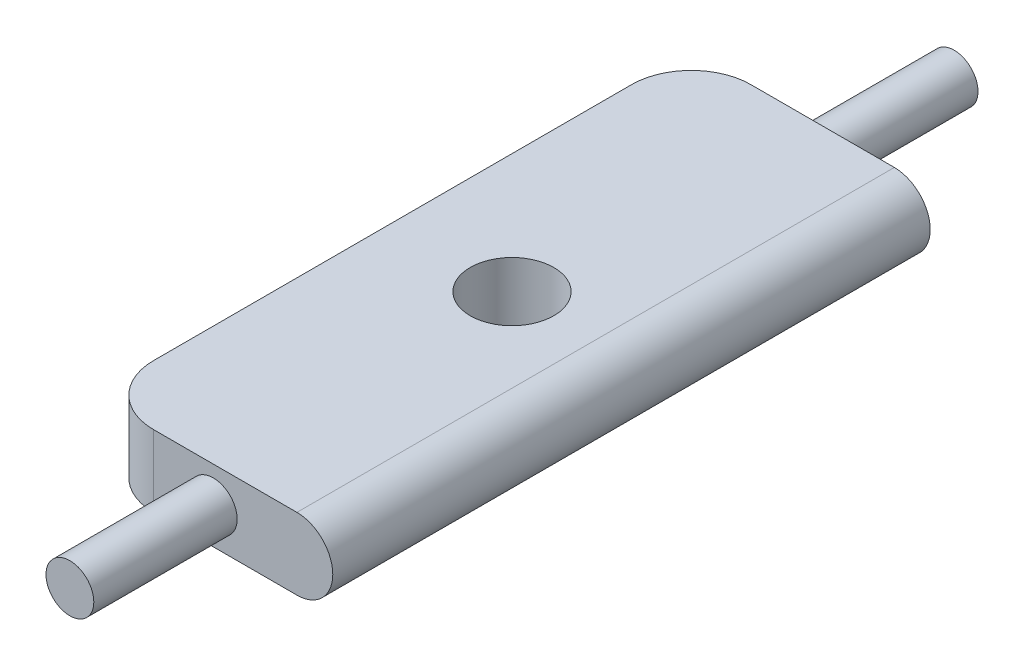
ISO-10303-21;
HEADER;
FILE_DESCRIPTION(('STEP AP214'),'2;1');
FILE_NAME('part.step','',(''),(''),'','','');
FILE_SCHEMA(('AUTOMOTIVE_DESIGN { 1 0 10303 214 1 1 1 1 }'));
ENDSEC;
DATA;
#1=APPLICATION_CONTEXT('core data for automotive mechanical design processes');
#2=APPLICATION_PROTOCOL_DEFINITION('international standard','automotive_design',2000,#1);
#3=PRODUCT_CONTEXT('',#1,'mechanical');
#4=PRODUCT('Part','Part','',(#3));
#5=PRODUCT_RELATED_PRODUCT_CATEGORY('part','',(#4));
#6=PRODUCT_DEFINITION_FORMATION('','',#4);
#7=PRODUCT_DEFINITION_CONTEXT('part definition',#1,'design');
#8=PRODUCT_DEFINITION('design','',#6,#7);
#9=PRODUCT_DEFINITION_SHAPE('','',#8);
#10=(LENGTH_UNIT() NAMED_UNIT(*) SI_UNIT(.MILLI.,.METRE.));
#11=(NAMED_UNIT(*) PLANE_ANGLE_UNIT() SI_UNIT($,.RADIAN.));
#12=(NAMED_UNIT(*) SI_UNIT($,.STERADIAN.) SOLID_ANGLE_UNIT());
#13=UNCERTAINTY_MEASURE_WITH_UNIT(LENGTH_MEASURE(1.E-05),#10,'distance_accuracy_value','');
#14=(GEOMETRIC_REPRESENTATION_CONTEXT(3) GLOBAL_UNCERTAINTY_ASSIGNED_CONTEXT((#13)) GLOBAL_UNIT_ASSIGNED_CONTEXT((#10,
#11,#12)) REPRESENTATION_CONTEXT('',''));
#15=CARTESIAN_POINT('',(0.,0.,0.));
#16=DIRECTION('',(0.,0.,1.));
#17=DIRECTION('',(1.,0.,0.));
#18=AXIS2_PLACEMENT_3D('',#15,#16,#17);
#19=CARTESIAN_POINT('',(17.,3.,0.));
#20=DIRECTION('',(0.,0.,-1.));
#21=DIRECTION('',(-1.,0.,0.));
#22=AXIS2_PLACEMENT_3D('',#19,#20,#21);
#23=CYLINDRICAL_SURFACE('',#22,3.);
#24=DIRECTION('',(0.,0.,-1.));
#25=VECTOR('',#24,1.);
#26=CARTESIAN_POINT('',(17.,6.,0.));
#27=LINE('',#26,#25);
#28=CARTESIAN_POINT('',(17.,6.,0.));
#29=VERTEX_POINT('',#28);
#30=CARTESIAN_POINT('',(17.,6.,-50.));
#31=VERTEX_POINT('',#30);
#32=EDGE_CURVE('E126',#29,#31,#27,.T.);
#33=ORIENTED_EDGE('',*,*,#32,.F.);
#34=CARTESIAN_POINT('',(17.,3.,0.));
#35=DIRECTION('',(0.,0.,-1.));
#36=DIRECTION('',(-1.,0.,0.));
#37=AXIS2_PLACEMENT_3D('',#34,#35,#36);
#38=CIRCLE('',#37,3.);
#39=CARTESIAN_POINT('',(17.,0.,0.));
#40=VERTEX_POINT('',#39);
#41=EDGE_CURVE('E44',#40,#29,#38,.F.);
#42=ORIENTED_EDGE('',*,*,#41,.F.);
#43=DIRECTION('',(0.,0.,1.));
#44=VECTOR('',#43,1.);
#45=CARTESIAN_POINT('',(17.,0.,0.));
#46=LINE('',#45,#44);
#47=CARTESIAN_POINT('',(17.,0.,-50.));
#48=VERTEX_POINT('',#47);
#49=EDGE_CURVE('E129',#48,#40,#46,.T.);
#50=ORIENTED_EDGE('',*,*,#49,.F.);
#51=CARTESIAN_POINT('',(17.,3.,-50.));
#52=DIRECTION('',(0.,0.,1.));
#53=DIRECTION('',(1.,0.,0.));
#54=AXIS2_PLACEMENT_3D('',#51,#52,#53);
#55=CIRCLE('',#54,3.);
#56=EDGE_CURVE('E11',#31,#48,#55,.F.);
#57=ORIENTED_EDGE('',*,*,#56,.F.);
#58=EDGE_LOOP('',(#33,#42,#50,#57));
#59=FACE_BOUND('',#58,.T.);
#60=ADVANCED_FACE('F36',(#59),#23,.T.);
#61=CARTESIAN_POINT('',(5.,6.,-5.));
#62=DIRECTION('',(0.,-1.,0.));
#63=DIRECTION('',(0.,0.,-1.));
#64=AXIS2_PLACEMENT_3D('',#61,#62,#63);
#65=CYLINDRICAL_SURFACE('',#64,5.);
#66=DIRECTION('',(0.,-1.,0.));
#67=VECTOR('',#66,1.);
#68=CARTESIAN_POINT('',(5.,6.,0.));
#69=LINE('',#68,#67);
#70=CARTESIAN_POINT('',(5.,6.,0.));
#71=VERTEX_POINT('',#70);
#72=CARTESIAN_POINT('',(5.,0.,0.));
#73=VERTEX_POINT('',#72);
#74=EDGE_CURVE('E116',#71,#73,#69,.T.);
#75=ORIENTED_EDGE('',*,*,#74,.F.);
#76=CARTESIAN_POINT('',(5.,6.,-5.));
#77=DIRECTION('',(0.,-1.,0.));
#78=DIRECTION('',(0.,0.,-1.));
#79=AXIS2_PLACEMENT_3D('',#76,#77,#78);
#80=CIRCLE('',#79,5.);
#81=CARTESIAN_POINT('',(0.,6.,-5.));
#82=VERTEX_POINT('',#81);
#83=EDGE_CURVE('E122',#82,#71,#80,.F.);
#84=ORIENTED_EDGE('',*,*,#83,.F.);
#85=DIRECTION('',(0.,-1.,0.));
#86=VECTOR('',#85,1.);
#87=CARTESIAN_POINT('',(0.,6.,-5.));
#88=LINE('',#87,#86);
#89=CARTESIAN_POINT('',(0.,0.,-5.));
#90=VERTEX_POINT('',#89);
#91=EDGE_CURVE('E119',#90,#82,#88,.F.);
#92=ORIENTED_EDGE('',*,*,#91,.F.);
#93=CARTESIAN_POINT('',(5.,0.,-5.));
#94=DIRECTION('',(0.,-1.,0.));
#95=DIRECTION('',(0.,0.,-1.));
#96=AXIS2_PLACEMENT_3D('',#93,#94,#95);
#97=CIRCLE('',#96,5.);
#98=EDGE_CURVE('E124',#73,#90,#97,.T.);
#99=ORIENTED_EDGE('',*,*,#98,.F.);
#100=EDGE_LOOP('',(#75,#84,#92,#99));
#101=FACE_BOUND('',#100,.T.);
#102=ADVANCED_FACE('F167',(#101),#65,.T.);
#103=CARTESIAN_POINT('',(5.,6.,-45.));
#104=DIRECTION('',(0.,1.,0.));
#105=DIRECTION('',(0.,0.,1.));
#106=AXIS2_PLACEMENT_3D('',#103,#104,#105);
#107=CYLINDRICAL_SURFACE('',#106,5.);
#108=DIRECTION('',(0.,1.,0.));
#109=VECTOR('',#108,1.);
#110=CARTESIAN_POINT('',(5.,6.,-50.));
#111=LINE('',#110,#109);
#112=CARTESIAN_POINT('',(5.,0.,-50.));
#113=VERTEX_POINT('',#112);
#114=CARTESIAN_POINT('',(5.,6.,-50.));
#115=VERTEX_POINT('',#114);
#116=EDGE_CURVE('E89',#113,#115,#111,.T.);
#117=ORIENTED_EDGE('',*,*,#116,.F.);
#118=CARTESIAN_POINT('',(5.,0.,-45.));
#119=DIRECTION('',(0.,-1.,0.));
#120=DIRECTION('',(0.,0.,-1.));
#121=AXIS2_PLACEMENT_3D('',#118,#119,#120);
#122=CIRCLE('',#121,5.);
#123=CARTESIAN_POINT('',(0.,0.,-45.));
#124=VERTEX_POINT('',#123);
#125=EDGE_CURVE('E95',#124,#113,#122,.T.);
#126=ORIENTED_EDGE('',*,*,#125,.F.);
#127=DIRECTION('',(0.,1.,0.));
#128=VECTOR('',#127,1.);
#129=CARTESIAN_POINT('',(0.,6.,-45.));
#130=LINE('',#129,#128);
#131=CARTESIAN_POINT('',(0.,6.,-45.));
#132=VERTEX_POINT('',#131);
#133=EDGE_CURVE('E103',#132,#124,#130,.F.);
#134=ORIENTED_EDGE('',*,*,#133,.F.);
#135=CARTESIAN_POINT('',(5.,6.,-45.));
#136=DIRECTION('',(0.,-1.,0.));
#137=DIRECTION('',(0.,0.,-1.));
#138=AXIS2_PLACEMENT_3D('',#135,#136,#137);
#139=CIRCLE('',#138,5.);
#140=EDGE_CURVE('E102',#115,#132,#139,.F.);
#141=ORIENTED_EDGE('',*,*,#140,.F.);
#142=EDGE_LOOP('',(#117,#126,#134,#141));
#143=FACE_BOUND('',#142,.T.);
#144=ADVANCED_FACE('F106',(#143),#107,.T.);
#145=CARTESIAN_POINT('',(0.,6.,0.));
#146=DIRECTION('',(1.,0.,0.));
#147=DIRECTION('',(0.,0.,-1.));
#148=AXIS2_PLACEMENT_3D('',#145,#146,#147);
#149=PLANE('',#148);
#150=DIRECTION('',(0.,0.,1.));
#151=VECTOR('',#150,1.);
#152=CARTESIAN_POINT('',(0.,0.,0.));
#153=LINE('',#152,#151);
#154=EDGE_CURVE('E98',#124,#90,#153,.T.);
#155=ORIENTED_EDGE('',*,*,#154,.T.);
#156=ORIENTED_EDGE('',*,*,#91,.T.);
#157=DIRECTION('',(0.,0.,1.));
#158=VECTOR('',#157,1.);
#159=CARTESIAN_POINT('',(0.,6.,0.));
#160=LINE('',#159,#158);
#161=EDGE_CURVE('E91',#132,#82,#160,.T.);
#162=ORIENTED_EDGE('',*,*,#161,.F.);
#163=ORIENTED_EDGE('',*,*,#133,.T.);
#164=EDGE_LOOP('',(#155,#156,#162,#163));
#165=FACE_BOUND('',#164,.T.);
#166=ADVANCED_FACE('F156',(#165),#149,.F.);
#167=CARTESIAN_POINT('',(0.,6.,0.));
#168=DIRECTION('',(0.,0.,-1.));
#169=DIRECTION('',(-1.,0.,0.));
#170=AXIS2_PLACEMENT_3D('',#167,#168,#169);
#171=PLANE('',#170);
#172=CARTESIAN_POINT('',(10.,3.,0.));
#173=DIRECTION('',(0.,0.,-1.));
#174=DIRECTION('',(-1.,0.,0.));
#175=AXIS2_PLACEMENT_3D('',#172,#173,#174);
#176=CIRCLE('',#175,2.);
#177=CARTESIAN_POINT('',(8.,3.,0.));
#178=VERTEX_POINT('',#177);
#179=EDGE_CURVE('E111',#178,#178,#176,.F.);
#180=ORIENTED_EDGE('',*,*,#179,.F.);
#181=EDGE_LOOP('',(#180));
#182=FACE_BOUND('',#181,.T.);
#183=DIRECTION('',(1.,0.,0.));
#184=VECTOR('',#183,1.);
#185=CARTESIAN_POINT('',(0.,0.,0.));
#186=LINE('',#185,#184);
#187=EDGE_CURVE('E92',#73,#40,#186,.T.);
#188=ORIENTED_EDGE('',*,*,#187,.T.);
#189=ORIENTED_EDGE('',*,*,#41,.T.);
#190=DIRECTION('',(1.,0.,0.));
#191=VECTOR('',#190,1.);
#192=CARTESIAN_POINT('',(0.,6.,0.));
#193=LINE('',#192,#191);
#194=EDGE_CURVE('E135',#71,#29,#193,.T.);
#195=ORIENTED_EDGE('',*,*,#194,.F.);
#196=ORIENTED_EDGE('',*,*,#74,.T.);
#197=EDGE_LOOP('',(#188,#189,#195,#196));
#198=FACE_BOUND('',#197,.T.);
#199=ADVANCED_FACE('F133',(#182,#198),#171,.F.);
#200=CARTESIAN_POINT('',(0.,6.,-50.));
#201=DIRECTION('',(0.,0.,1.));
#202=DIRECTION('',(1.,0.,0.));
#203=AXIS2_PLACEMENT_3D('',#200,#201,#202);
#204=PLANE('',#203);
#205=CARTESIAN_POINT('',(10.,3.,-50.));
#206=DIRECTION('',(0.,0.,1.));
#207=DIRECTION('',(1.,0.,0.));
#208=AXIS2_PLACEMENT_3D('',#205,#206,#207);
#209=CIRCLE('',#208,2.);
#210=CARTESIAN_POINT('',(12.,3.,-50.));
#211=VERTEX_POINT('',#210);
#212=EDGE_CURVE('E107',#211,#211,#209,.F.);
#213=ORIENTED_EDGE('',*,*,#212,.F.);
#214=EDGE_LOOP('',(#213));
#215=FACE_BOUND('',#214,.T.);
#216=DIRECTION('',(-1.,0.,0.));
#217=VECTOR('',#216,1.);
#218=CARTESIAN_POINT('',(0.,6.,-50.));
#219=LINE('',#218,#217);
#220=EDGE_CURVE('E141',#31,#115,#219,.T.);
#221=ORIENTED_EDGE('',*,*,#220,.F.);
#222=ORIENTED_EDGE('',*,*,#56,.T.);
#223=DIRECTION('',(-1.,0.,0.));
#224=VECTOR('',#223,1.);
#225=CARTESIAN_POINT('',(0.,0.,-50.));
#226=LINE('',#225,#224);
#227=EDGE_CURVE('E85',#48,#113,#226,.T.);
#228=ORIENTED_EDGE('',*,*,#227,.T.);
#229=ORIENTED_EDGE('',*,*,#116,.T.);
#230=EDGE_LOOP('',(#221,#222,#228,#229));
#231=FACE_BOUND('',#230,.T.);
#232=ADVANCED_FACE('F87',(#215,#231),#204,.F.);
#233=CARTESIAN_POINT('',(0.,6.,0.));
#234=DIRECTION('',(0.,-1.,0.));
#235=DIRECTION('',(0.,0.,-1.));
#236=AXIS2_PLACEMENT_3D('',#233,#234,#235);
#237=PLANE('',#236);
#238=CARTESIAN_POINT('',(10.,6.,-25.));
#239=DIRECTION('',(0.,1.,0.));
#240=DIRECTION('',(0.,0.,1.));
#241=AXIS2_PLACEMENT_3D('',#238,#239,#240);
#242=CIRCLE('',#241,3.5);
#243=CARTESIAN_POINT('',(10.,6.,-21.5));
#244=VERTEX_POINT('',#243);
#245=EDGE_CURVE('E275',#244,#244,#242,.T.);
#246=ORIENTED_EDGE('',*,*,#245,.F.);
#247=EDGE_LOOP('',(#246));
#248=FACE_BOUND('',#247,.T.);
#249=ORIENTED_EDGE('',*,*,#194,.T.);
#250=ORIENTED_EDGE('',*,*,#32,.T.);
#251=ORIENTED_EDGE('',*,*,#220,.T.);
#252=ORIENTED_EDGE('',*,*,#140,.T.);
#253=ORIENTED_EDGE('',*,*,#161,.T.);
#254=ORIENTED_EDGE('',*,*,#83,.T.);
#255=EDGE_LOOP('',(#249,#250,#251,#252,#253,#254));
#256=FACE_BOUND('',#255,.T.);
#257=ADVANCED_FACE('F138',(#248,#256),#237,.F.);
#258=CARTESIAN_POINT('',(0.,0.,0.));
#259=DIRECTION('',(0.,-1.,0.));
#260=DIRECTION('',(0.,0.,-1.));
#261=AXIS2_PLACEMENT_3D('',#258,#259,#260);
#262=PLANE('',#261);
#263=CARTESIAN_POINT('',(10.,0.,-25.));
#264=DIRECTION('',(0.,1.,0.));
#265=DIRECTION('',(0.,0.,1.));
#266=AXIS2_PLACEMENT_3D('',#263,#264,#265);
#267=CIRCLE('',#266,3.5);
#268=CARTESIAN_POINT('',(10.,0.,-21.5));
#269=VERTEX_POINT('',#268);
#270=EDGE_CURVE('E148',#269,#269,#267,.T.);
#271=ORIENTED_EDGE('',*,*,#270,.T.);
#272=EDGE_LOOP('',(#271));
#273=FACE_BOUND('',#272,.T.);
#274=ORIENTED_EDGE('',*,*,#227,.F.);
#275=ORIENTED_EDGE('',*,*,#49,.T.);
#276=ORIENTED_EDGE('',*,*,#187,.F.);
#277=ORIENTED_EDGE('',*,*,#98,.T.);
#278=ORIENTED_EDGE('',*,*,#154,.F.);
#279=ORIENTED_EDGE('',*,*,#125,.T.);
#280=EDGE_LOOP('',(#274,#275,#276,#277,#278,#279));
#281=FACE_BOUND('',#280,.T.);
#282=ADVANCED_FACE('F96',(#273,#281),#262,.T.);
#283=CARTESIAN_POINT('',(10.,0.,-25.));
#284=DIRECTION('',(0.,1.,0.));
#285=DIRECTION('',(0.,0.,1.));
#286=AXIS2_PLACEMENT_3D('',#283,#284,#285);
#287=CYLINDRICAL_SURFACE('',#286,3.5);
#288=ORIENTED_EDGE('',*,*,#270,.F.);
#289=EDGE_LOOP('',(#288));
#290=FACE_BOUND('',#289,.T.);
#291=ORIENTED_EDGE('',*,*,#245,.T.);
#292=EDGE_LOOP('',(#291));
#293=FACE_BOUND('',#292,.T.);
#294=ADVANCED_FACE('F220',(#290,#293),#287,.F.);
#295=CARTESIAN_POINT('',(10.,3.,4.));
#296=DIRECTION('',(0.,0.,-1.));
#297=DIRECTION('',(-1.,0.,0.));
#298=AXIS2_PLACEMENT_3D('',#295,#296,#297);
#299=CYLINDRICAL_SURFACE('',#298,2.);
#300=ORIENTED_EDGE('',*,*,#179,.T.);
#301=EDGE_LOOP('',(#300));
#302=FACE_BOUND('',#301,.T.);
#303=CARTESIAN_POINT('',(10.,3.,12.));
#304=DIRECTION('',(0.,0.,1.));
#305=DIRECTION('',(1.,0.,0.));
#306=AXIS2_PLACEMENT_3D('',#303,#304,#305);
#307=CIRCLE('',#306,2.);
#308=CARTESIAN_POINT('',(12.,3.,12.));
#309=VERTEX_POINT('',#308);
#310=EDGE_CURVE('E279',#309,#309,#307,.T.);
#311=ORIENTED_EDGE('',*,*,#310,.F.);
#312=EDGE_LOOP('',(#311));
#313=FACE_BOUND('',#312,.T.);
#314=ADVANCED_FACE('F152',(#302,#313),#299,.T.);
#315=CARTESIAN_POINT('',(10.,3.,-54.));
#316=DIRECTION('',(0.,0.,1.));
#317=DIRECTION('',(1.,0.,0.));
#318=AXIS2_PLACEMENT_3D('',#315,#316,#317);
#319=CYLINDRICAL_SURFACE('',#318,2.);
#320=ORIENTED_EDGE('',*,*,#212,.T.);
#321=EDGE_LOOP('',(#320));
#322=FACE_BOUND('',#321,.T.);
#323=CARTESIAN_POINT('',(10.,3.,-62.));
#324=DIRECTION('',(0.,0.,-1.));
#325=DIRECTION('',(-1.,0.,0.));
#326=AXIS2_PLACEMENT_3D('',#323,#324,#325);
#327=CIRCLE('',#326,2.);
#328=CARTESIAN_POINT('',(8.,3.,-62.));
#329=VERTEX_POINT('',#328);
#330=EDGE_CURVE('E276',#329,#329,#327,.T.);
#331=ORIENTED_EDGE('',*,*,#330,.F.);
#332=EDGE_LOOP('',(#331));
#333=FACE_BOUND('',#332,.T.);
#334=ADVANCED_FACE('F228',(#322,#333),#319,.T.);
#335=CARTESIAN_POINT('',(10.,3.,-62.));
#336=DIRECTION('',(0.,0.,-1.));
#337=DIRECTION('',(-1.,0.,0.));
#338=AXIS2_PLACEMENT_3D('',#335,#336,#337);
#339=PLANE('',#338);
#340=ORIENTED_EDGE('',*,*,#330,.T.);
#341=EDGE_LOOP('',(#340));
#342=FACE_BOUND('',#341,.T.);
#343=ADVANCED_FACE('F232',(#342),#339,.T.);
#344=CARTESIAN_POINT('',(10.,3.,12.));
#345=DIRECTION('',(0.,0.,1.));
#346=DIRECTION('',(1.,0.,0.));
#347=AXIS2_PLACEMENT_3D('',#344,#345,#346);
#348=PLANE('',#347);
#349=ORIENTED_EDGE('',*,*,#310,.T.);
#350=EDGE_LOOP('',(#349));
#351=FACE_BOUND('',#350,.T.);
#352=ADVANCED_FACE('F244',(#351),#348,.T.);
#353=CLOSED_SHELL('',(#60,#102,#144,#166,#199,#232,#257,#282,#294,#314,#334,#343,#352));
#354=MANIFOLD_SOLID_BREP('B2',#353);
#355=ADVANCED_BREP_SHAPE_REPRESENTATION('',(#18,#354),#14);
#356=SHAPE_DEFINITION_REPRESENTATION(#9,#355);
ENDSEC;
END-ISO-10303-21;
